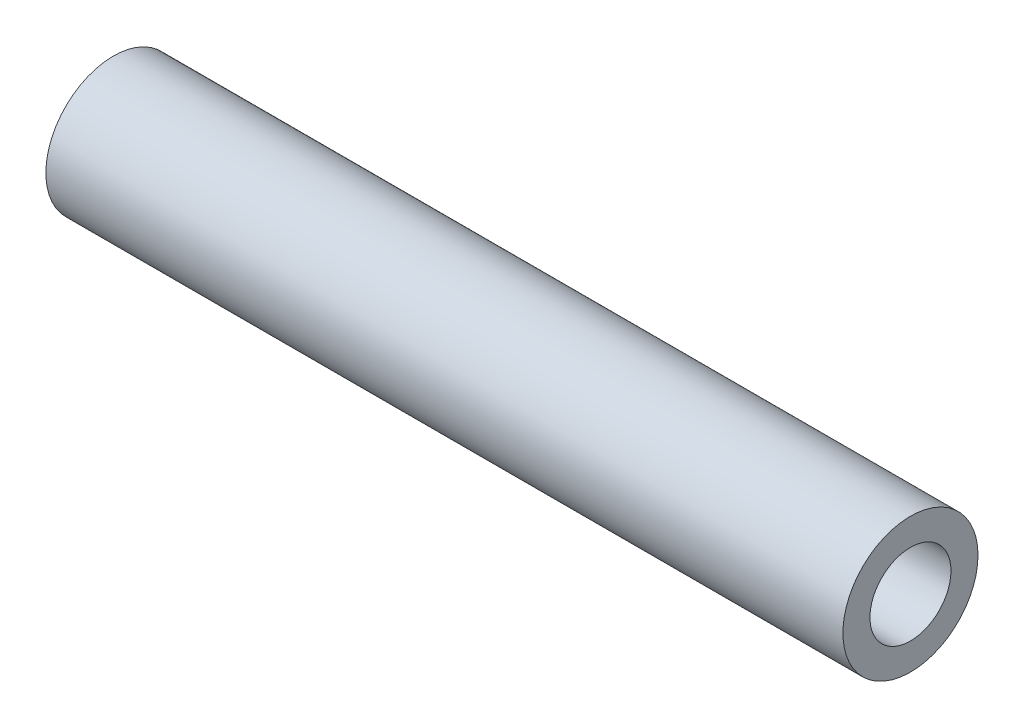
ISO-10303-21;
HEADER;
FILE_DESCRIPTION(('STEP AP214'),'2;1');
FILE_NAME('part.step','',(''),(''),'','','');
FILE_SCHEMA(('AUTOMOTIVE_DESIGN { 1 0 10303 214 1 1 1 1 }'));
ENDSEC;
DATA;
#1=APPLICATION_CONTEXT('core data for automotive mechanical design processes');
#2=APPLICATION_PROTOCOL_DEFINITION('international standard','automotive_design',2000,#1);
#3=PRODUCT_CONTEXT('',#1,'mechanical');
#4=PRODUCT('Part','Part','',(#3));
#5=PRODUCT_RELATED_PRODUCT_CATEGORY('part','',(#4));
#6=PRODUCT_DEFINITION_FORMATION('','',#4);
#7=PRODUCT_DEFINITION_CONTEXT('part definition',#1,'design');
#8=PRODUCT_DEFINITION('design','',#6,#7);
#9=PRODUCT_DEFINITION_SHAPE('','',#8);
#10=(LENGTH_UNIT() NAMED_UNIT(*) SI_UNIT(.MILLI.,.METRE.));
#11=(NAMED_UNIT(*) PLANE_ANGLE_UNIT() SI_UNIT($,.RADIAN.));
#12=(NAMED_UNIT(*) SI_UNIT($,.STERADIAN.) SOLID_ANGLE_UNIT());
#13=UNCERTAINTY_MEASURE_WITH_UNIT(LENGTH_MEASURE(1.E-05),#10,'distance_accuracy_value','');
#14=(GEOMETRIC_REPRESENTATION_CONTEXT(3) GLOBAL_UNCERTAINTY_ASSIGNED_CONTEXT((#13)) GLOBAL_UNIT_ASSIGNED_CONTEXT((#10,
#11,#12)) REPRESENTATION_CONTEXT('',''));
#15=CARTESIAN_POINT('',(0.,0.,0.));
#16=DIRECTION('',(0.,0.,1.));
#17=DIRECTION('',(1.,0.,0.));
#18=AXIS2_PLACEMENT_3D('',#15,#16,#17);
#19=CARTESIAN_POINT('',(29.5,0.,0.));
#20=DIRECTION('',(1.,0.,0.));
#21=DIRECTION('',(0.,0.,-1.));
#22=AXIS2_PLACEMENT_3D('',#19,#20,#21);
#23=PLANE('',#22);
#24=CARTESIAN_POINT('',(29.5,0.,0.));
#25=DIRECTION('',(1.,0.,0.));
#26=DIRECTION('',(0.,0.,-1.));
#27=AXIS2_PLACEMENT_3D('',#24,#25,#26);
#28=CIRCLE('',#27,2.5);
#29=CARTESIAN_POINT('',(29.5,0.,-2.5));
#30=VERTEX_POINT('',#29);
#31=EDGE_CURVE('E10',#30,#30,#28,.T.);
#32=ORIENTED_EDGE('',*,*,#31,.T.);
#33=EDGE_LOOP('',(#32));
#34=FACE_BOUND('',#33,.T.);
#35=CARTESIAN_POINT('',(29.5,0.,0.));
#36=DIRECTION('',(1.,0.,0.));
#37=DIRECTION('',(0.,0.,-1.));
#38=AXIS2_PLACEMENT_3D('',#35,#36,#37);
#39=CIRCLE('',#38,1.5);
#40=CARTESIAN_POINT('',(29.5,0.,-1.5));
#41=VERTEX_POINT('',#40);
#42=EDGE_CURVE('E58',#41,#41,#39,.T.);
#43=ORIENTED_EDGE('',*,*,#42,.F.);
#44=EDGE_LOOP('',(#43));
#45=FACE_BOUND('',#44,.T.);
#46=ADVANCED_FACE('F45',(#34,#45),#23,.T.);
#47=CARTESIAN_POINT('',(0.,0.,0.));
#48=DIRECTION('',(1.,0.,0.));
#49=DIRECTION('',(0.,0.,-1.));
#50=AXIS2_PLACEMENT_3D('',#47,#48,#49);
#51=PLANE('',#50);
#52=CARTESIAN_POINT('',(0.,0.,0.));
#53=DIRECTION('',(1.,0.,0.));
#54=DIRECTION('',(0.,0.,-1.));
#55=AXIS2_PLACEMENT_3D('',#52,#53,#54);
#56=CIRCLE('',#55,2.5);
#57=CARTESIAN_POINT('',(0.,0.,-2.5));
#58=VERTEX_POINT('',#57);
#59=EDGE_CURVE('E49',#58,#58,#56,.T.);
#60=ORIENTED_EDGE('',*,*,#59,.F.);
#61=EDGE_LOOP('',(#60));
#62=FACE_BOUND('',#61,.T.);
#63=CARTESIAN_POINT('',(0.,0.,0.));
#64=DIRECTION('',(1.,0.,0.));
#65=DIRECTION('',(0.,0.,-1.));
#66=AXIS2_PLACEMENT_3D('',#63,#64,#65);
#67=CIRCLE('',#66,1.5);
#68=CARTESIAN_POINT('',(0.,0.,-1.5));
#69=VERTEX_POINT('',#68);
#70=EDGE_CURVE('E60',#69,#69,#67,.T.);
#71=ORIENTED_EDGE('',*,*,#70,.T.);
#72=EDGE_LOOP('',(#71));
#73=FACE_BOUND('',#72,.T.);
#74=ADVANCED_FACE('F72',(#62,#73),#51,.F.);
#75=CARTESIAN_POINT('',(29.5,0.,0.));
#76=DIRECTION('',(-1.,0.,0.));
#77=DIRECTION('',(0.,0.,1.));
#78=AXIS2_PLACEMENT_3D('',#75,#76,#77);
#79=CYLINDRICAL_SURFACE('',#78,2.5);
#80=ORIENTED_EDGE('',*,*,#31,.F.);
#81=EDGE_LOOP('',(#80));
#82=FACE_BOUND('',#81,.T.);
#83=ORIENTED_EDGE('',*,*,#59,.T.);
#84=EDGE_LOOP('',(#83));
#85=FACE_BOUND('',#84,.T.);
#86=ADVANCED_FACE('F47',(#82,#85),#79,.T.);
#87=CARTESIAN_POINT('',(29.5,0.,0.));
#88=DIRECTION('',(-1.,0.,0.));
#89=DIRECTION('',(0.,0.,1.));
#90=AXIS2_PLACEMENT_3D('',#87,#88,#89);
#91=CYLINDRICAL_SURFACE('',#90,1.5);
#92=ORIENTED_EDGE('',*,*,#42,.T.);
#93=EDGE_LOOP('',(#92));
#94=FACE_BOUND('',#93,.T.);
#95=ORIENTED_EDGE('',*,*,#70,.F.);
#96=EDGE_LOOP('',(#95));
#97=FACE_BOUND('',#96,.T.);
#98=ADVANCED_FACE('F68',(#94,#97),#91,.F.);
#99=CLOSED_SHELL('',(#46,#74,#86,#98));
#100=MANIFOLD_SOLID_BREP('B2',#99);
#101=ADVANCED_BREP_SHAPE_REPRESENTATION('',(#18,#100),#14);
#102=SHAPE_DEFINITION_REPRESENTATION(#9,#101);
ENDSEC;
END-ISO-10303-21;
